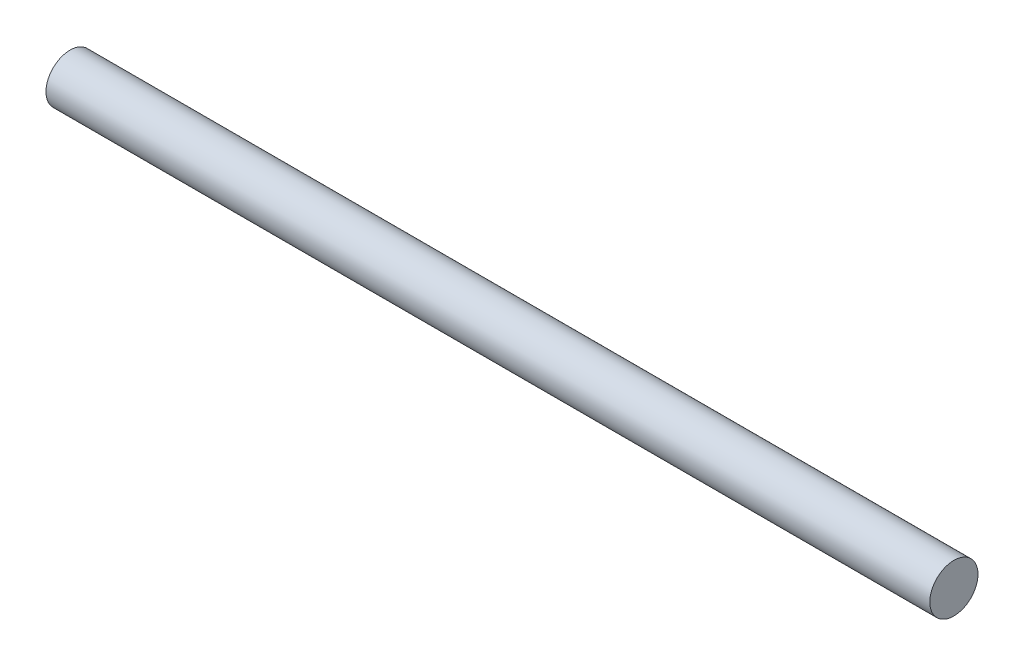
ISO-10303-21;
HEADER;
FILE_DESCRIPTION(('STEP AP214'),'2;1');
FILE_NAME('part.step','',(''),(''),'','','');
FILE_SCHEMA(('AUTOMOTIVE_DESIGN { 1 0 10303 214 1 1 1 1 }'));
ENDSEC;
DATA;
#1=APPLICATION_CONTEXT('core data for automotive mechanical design processes');
#2=APPLICATION_PROTOCOL_DEFINITION('international standard','automotive_design',2000,#1);
#3=PRODUCT_CONTEXT('',#1,'mechanical');
#4=PRODUCT('Part','Part','',(#3));
#5=PRODUCT_RELATED_PRODUCT_CATEGORY('part','',(#4));
#6=PRODUCT_DEFINITION_FORMATION('','',#4);
#7=PRODUCT_DEFINITION_CONTEXT('part definition',#1,'design');
#8=PRODUCT_DEFINITION('design','',#6,#7);
#9=PRODUCT_DEFINITION_SHAPE('','',#8);
#10=(LENGTH_UNIT() NAMED_UNIT(*) SI_UNIT(.MILLI.,.METRE.));
#11=(NAMED_UNIT(*) PLANE_ANGLE_UNIT() SI_UNIT($,.RADIAN.));
#12=(NAMED_UNIT(*) SI_UNIT($,.STERADIAN.) SOLID_ANGLE_UNIT());
#13=UNCERTAINTY_MEASURE_WITH_UNIT(LENGTH_MEASURE(1.E-05),#10,'distance_accuracy_value','');
#14=(GEOMETRIC_REPRESENTATION_CONTEXT(3) GLOBAL_UNCERTAINTY_ASSIGNED_CONTEXT((#13)) GLOBAL_UNIT_ASSIGNED_CONTEXT((#10,
#11,#12)) REPRESENTATION_CONTEXT('',''));
#15=CARTESIAN_POINT('',(0.,0.,0.));
#16=DIRECTION('',(0.,0.,1.));
#17=DIRECTION('',(1.,0.,0.));
#18=AXIS2_PLACEMENT_3D('',#15,#16,#17);
#19=CARTESIAN_POINT('',(55.,0.,0.));
#20=DIRECTION('',(-1.,0.,0.));
#21=DIRECTION('',(0.,0.,1.));
#22=AXIS2_PLACEMENT_3D('',#19,#20,#21);
#23=CYLINDRICAL_SURFACE('',#22,1.5);
#24=CARTESIAN_POINT('',(55.,0.,0.));
#25=DIRECTION('',(1.,0.,0.));
#26=DIRECTION('',(0.,0.,-1.));
#27=AXIS2_PLACEMENT_3D('',#24,#25,#26);
#28=CIRCLE('',#27,1.5);
#29=CARTESIAN_POINT('',(55.,0.,-1.5));
#30=VERTEX_POINT('',#29);
#31=EDGE_CURVE('E10',#30,#30,#28,.T.);
#32=ORIENTED_EDGE('',*,*,#31,.F.);
#33=EDGE_LOOP('',(#32));
#34=FACE_BOUND('',#33,.T.);
#35=CARTESIAN_POINT('',(0.,0.,0.));
#36=DIRECTION('',(1.,0.,0.));
#37=DIRECTION('',(0.,0.,-1.));
#38=AXIS2_PLACEMENT_3D('',#35,#36,#37);
#39=CIRCLE('',#38,1.5);
#40=CARTESIAN_POINT('',(0.,0.,-1.5));
#41=VERTEX_POINT('',#40);
#42=EDGE_CURVE('E41',#41,#41,#39,.T.);
#43=ORIENTED_EDGE('',*,*,#42,.T.);
#44=EDGE_LOOP('',(#43));
#45=FACE_BOUND('',#44,.T.);
#46=ADVANCED_FACE('F38',(#34,#45),#23,.T.);
#47=CARTESIAN_POINT('',(55.,0.,0.));
#48=DIRECTION('',(1.,0.,0.));
#49=DIRECTION('',(0.,0.,-1.));
#50=AXIS2_PLACEMENT_3D('',#47,#48,#49);
#51=PLANE('',#50);
#52=ORIENTED_EDGE('',*,*,#31,.T.);
#53=EDGE_LOOP('',(#52));
#54=FACE_BOUND('',#53,.T.);
#55=ADVANCED_FACE('F55',(#54),#51,.T.);
#56=CARTESIAN_POINT('',(0.,0.,0.));
#57=DIRECTION('',(1.,0.,0.));
#58=DIRECTION('',(0.,0.,-1.));
#59=AXIS2_PLACEMENT_3D('',#56,#57,#58);
#60=PLANE('',#59);
#61=ORIENTED_EDGE('',*,*,#42,.F.);
#62=EDGE_LOOP('',(#61));
#63=FACE_BOUND('',#62,.T.);
#64=ADVANCED_FACE('F53',(#63),#60,.F.);
#65=CLOSED_SHELL('',(#46,#55,#64));
#66=MANIFOLD_SOLID_BREP('B2',#65);
#67=ADVANCED_BREP_SHAPE_REPRESENTATION('',(#18,#66),#14);
#68=SHAPE_DEFINITION_REPRESENTATION(#9,#67);
ENDSEC;
END-ISO-10303-21;
